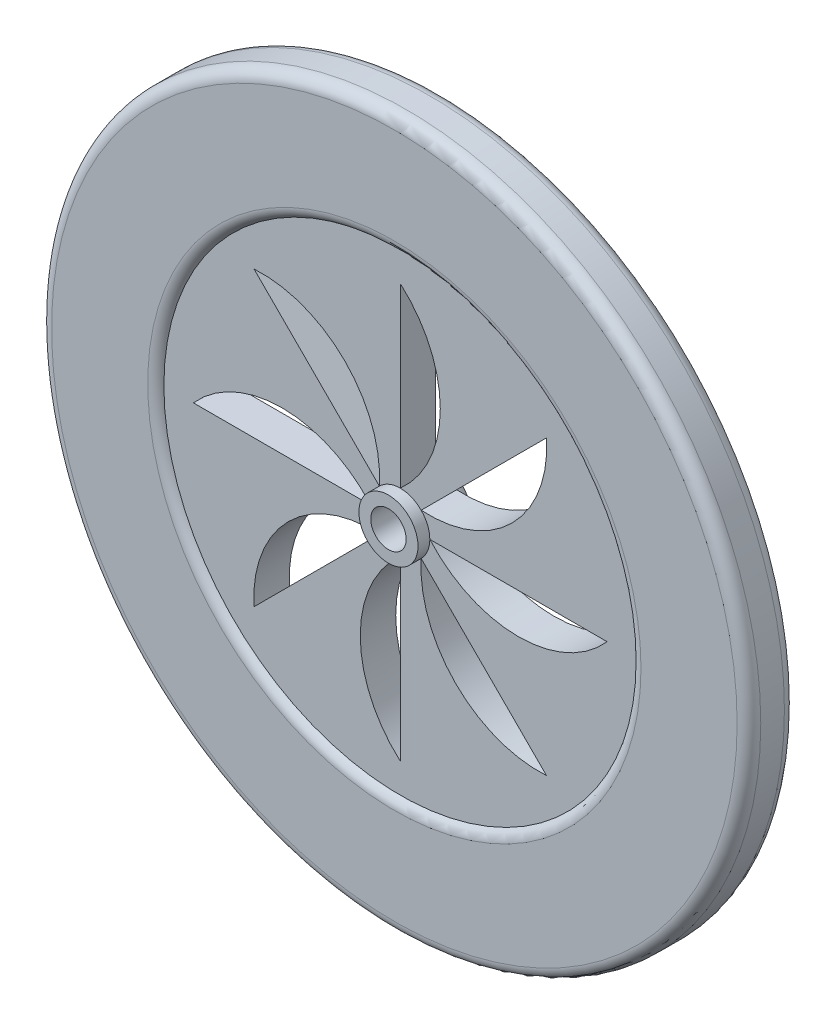
ISO-10303-21;
HEADER;
FILE_DESCRIPTION(('STEP AP214'),'2;1');
FILE_NAME('part.step','',(''),(''),'','','');
FILE_SCHEMA(('AUTOMOTIVE_DESIGN { 1 0 10303 214 1 1 1 1 }'));
ENDSEC;
DATA;
#1=APPLICATION_CONTEXT('core data for automotive mechanical design processes');
#2=APPLICATION_PROTOCOL_DEFINITION('international standard','automotive_design',2000,#1);
#3=PRODUCT_CONTEXT('',#1,'mechanical');
#4=PRODUCT('Part','Part','',(#3));
#5=PRODUCT_RELATED_PRODUCT_CATEGORY('part','',(#4));
#6=PRODUCT_DEFINITION_FORMATION('','',#4);
#7=PRODUCT_DEFINITION_CONTEXT('part definition',#1,'design');
#8=PRODUCT_DEFINITION('design','',#6,#7);
#9=PRODUCT_DEFINITION_SHAPE('','',#8);
#10=(LENGTH_UNIT() NAMED_UNIT(*) SI_UNIT(.MILLI.,.METRE.));
#11=(NAMED_UNIT(*) PLANE_ANGLE_UNIT() SI_UNIT($,.RADIAN.));
#12=(NAMED_UNIT(*) SI_UNIT($,.STERADIAN.) SOLID_ANGLE_UNIT());
#13=UNCERTAINTY_MEASURE_WITH_UNIT(LENGTH_MEASURE(1.E-05),#10,'distance_accuracy_value','');
#14=(GEOMETRIC_REPRESENTATION_CONTEXT(3) GLOBAL_UNCERTAINTY_ASSIGNED_CONTEXT((#13)) GLOBAL_UNIT_ASSIGNED_CONTEXT((#10,
#11,#12)) REPRESENTATION_CONTEXT('',''));
#15=CARTESIAN_POINT('',(0.,0.,0.));
#16=DIRECTION('',(0.,0.,1.));
#17=DIRECTION('',(1.,0.,0.));
#18=AXIS2_PLACEMENT_3D('',#15,#16,#17);
#19=CARTESIAN_POINT('',(0.,0.,2.5));
#20=DIRECTION('',(0.,0.,-1.));
#21=DIRECTION('',(-1.,0.,0.));
#22=AXIS2_PLACEMENT_3D('',#19,#20,#21);
#23=CYLINDRICAL_SURFACE('',#22,2.5);
#24=CARTESIAN_POINT('',(0.,0.,1.5));
#25=DIRECTION('',(0.,0.,1.));
#26=DIRECTION('',(1.,0.,0.));
#27=AXIS2_PLACEMENT_3D('',#24,#25,#26);
#28=CIRCLE('',#27,2.5);
#29=CARTESIAN_POINT('',(2.5,0.,1.5));
#30=VERTEX_POINT('',#29);
#31=CARTESIAN_POINT('',(1.76776695296637,1.76776695296637,1.5));
#32=VERTEX_POINT('',#31);
#33=EDGE_CURVE('E390',#30,#32,#28,.T.);
#34=ORIENTED_EDGE('',*,*,#33,.T.);
#35=CARTESIAN_POINT('',(0.,2.5,1.5));
#36=VERTEX_POINT('',#35);
#37=EDGE_CURVE('E400',#32,#36,#28,.T.);
#38=ORIENTED_EDGE('',*,*,#37,.T.);
#39=CARTESIAN_POINT('',(-1.76776695296635,1.76776695296639,1.5));
#40=VERTEX_POINT('',#39);
#41=EDGE_CURVE('E603',#36,#40,#28,.T.);
#42=ORIENTED_EDGE('',*,*,#41,.T.);
#43=CARTESIAN_POINT('',(-2.5,0.,1.5));
#44=VERTEX_POINT('',#43);
#45=EDGE_CURVE('E605',#40,#44,#28,.T.);
#46=ORIENTED_EDGE('',*,*,#45,.T.);
#47=CARTESIAN_POINT('',(-1.76776695296638,-1.76776695296635,1.5));
#48=VERTEX_POINT('',#47);
#49=EDGE_CURVE('E608',#44,#48,#28,.T.);
#50=ORIENTED_EDGE('',*,*,#49,.T.);
#51=CARTESIAN_POINT('',(0.,-2.5,1.5));
#52=VERTEX_POINT('',#51);
#53=EDGE_CURVE('E612',#48,#52,#28,.T.);
#54=ORIENTED_EDGE('',*,*,#53,.T.);
#55=CARTESIAN_POINT('',(1.76776695296636,-1.76776695296638,1.5));
#56=VERTEX_POINT('',#55);
#57=EDGE_CURVE('E593',#52,#56,#28,.T.);
#58=ORIENTED_EDGE('',*,*,#57,.T.);
#59=EDGE_CURVE('E384',#56,#30,#28,.T.);
#60=ORIENTED_EDGE('',*,*,#59,.T.);
#61=EDGE_LOOP('',(#34,#38,#42,#46,#50,#54,#58,#60));
#62=FACE_BOUND('',#61,.T.);
#63=CARTESIAN_POINT('',(0.,0.,2.5));
#64=DIRECTION('',(0.,0.,1.));
#65=DIRECTION('',(1.,0.,0.));
#66=AXIS2_PLACEMENT_3D('',#63,#64,#65);
#67=CIRCLE('',#66,2.5);
#68=CARTESIAN_POINT('',(2.5,0.,2.5));
#69=VERTEX_POINT('',#68);
#70=EDGE_CURVE('E385',#69,#69,#67,.T.);
#71=ORIENTED_EDGE('',*,*,#70,.F.);
#72=EDGE_LOOP('',(#71));
#73=FACE_BOUND('',#72,.T.);
#74=ADVANCED_FACE('F45',(#62,#73),#23,.T.);
#75=CARTESIAN_POINT('',(0.,0.,2.5));
#76=DIRECTION('',(0.,0.,1.));
#77=DIRECTION('',(1.,0.,0.));
#78=AXIS2_PLACEMENT_3D('',#75,#76,#77);
#79=PLANE('',#78);
#80=CARTESIAN_POINT('',(0.,0.,2.5));
#81=DIRECTION('',(0.,0.,1.));
#82=DIRECTION('',(1.,0.,0.));
#83=AXIS2_PLACEMENT_3D('',#80,#81,#82);
#84=CIRCLE('',#83,1.5);
#85=CARTESIAN_POINT('',(1.5,0.,2.5));
#86=VERTEX_POINT('',#85);
#87=EDGE_CURVE('E195',#86,#86,#84,.T.);
#88=ORIENTED_EDGE('',*,*,#87,.F.);
#89=EDGE_LOOP('',(#88));
#90=FACE_BOUND('',#89,.T.);
#91=ORIENTED_EDGE('',*,*,#70,.T.);
#92=EDGE_LOOP('',(#91));
#93=FACE_BOUND('',#92,.T.);
#94=ADVANCED_FACE('F447',(#90,#93),#79,.T.);
#95=CARTESIAN_POINT('',(0.,0.,1.5));
#96=DIRECTION('',(0.,0.,1.));
#97=DIRECTION('',(1.,0.,0.));
#98=AXIS2_PLACEMENT_3D('',#95,#96,#97);
#99=PLANE('',#98);
#100=CARTESIAN_POINT('',(6.61437827766162,-10.,1.5));
#101=DIRECTION('',(0.,0.,1.));
#102=DIRECTION('',(-1.,0.,0.));
#103=AXIS2_PLACEMENT_3D('',#100,#101,#102);
#104=CIRCLE('',#103,10.0000000000001);
#105=CARTESIAN_POINT('',(1.43027032251381E-13,-17.5,1.5));
#106=VERTEX_POINT('',#105);
#107=EDGE_CURVE('E69',#52,#106,#104,.T.);
#108=ORIENTED_EDGE('',*,*,#107,.F.);
#109=ORIENTED_EDGE('',*,*,#53,.F.);
#110=DIRECTION('',(0.707106781186541,0.707106781186554,0.));
#111=VECTOR('',#110,1.);
#112=CARTESIAN_POINT('',(-1.76776695296638,-1.76776695296635,1.5));
#113=LINE('',#112,#111);
#114=CARTESIAN_POINT('',(-12.3743686707645,-12.3743686707646,1.5));
#115=VERTEX_POINT('',#114);
#116=EDGE_CURVE('E238',#115,#48,#113,.T.);
#117=ORIENTED_EDGE('',*,*,#116,.F.);
#118=CARTESIAN_POINT('',(-2.39399607839793,-11.748139545333,1.5));
#119=DIRECTION('',(0.,0.,1.));
#120=DIRECTION('',(-1.,0.,0.));
#121=AXIS2_PLACEMENT_3D('',#118,#119,#120);
#122=CIRCLE('',#121,10.);
#123=EDGE_CURVE('E242',#48,#115,#122,.T.);
#124=ORIENTED_EDGE('',*,*,#123,.F.);
#125=ORIENTED_EDGE('',*,*,#49,.F.);
#126=DIRECTION('',(1.,0.,0.));
#127=VECTOR('',#126,1.);
#128=CARTESIAN_POINT('',(-2.5,0.,1.5));
#129=LINE('',#128,#127);
#130=CARTESIAN_POINT('',(-17.4999999999999,0.,1.5));
#131=VERTEX_POINT('',#130);
#132=EDGE_CURVE('E260',#131,#44,#129,.T.);
#133=ORIENTED_EDGE('',*,*,#132,.F.);
#134=CARTESIAN_POINT('',(-9.99999999999993,-6.61437827766155,1.5));
#135=DIRECTION('',(0.,0.,1.));
#136=DIRECTION('',(-1.,0.,0.));
#137=AXIS2_PLACEMENT_3D('',#134,#135,#136);
#138=CIRCLE('',#137,10.);
#139=EDGE_CURVE('E237',#44,#131,#138,.T.);
#140=ORIENTED_EDGE('',*,*,#139,.F.);
#141=ORIENTED_EDGE('',*,*,#45,.F.);
#142=DIRECTION('',(0.70710678118655,-0.707106781186545,0.));
#143=VECTOR('',#142,1.);
#144=CARTESIAN_POINT('',(-1.76776695296635,1.76776695296639,1.5));
#145=LINE('',#144,#143);
#146=CARTESIAN_POINT('',(-12.3743686707646,12.3743686707645,1.5));
#147=VERTEX_POINT('',#146);
#148=EDGE_CURVE('E214',#147,#40,#145,.T.);
#149=ORIENTED_EDGE('',*,*,#148,.F.);
#150=CARTESIAN_POINT('',(-11.7481395453329,2.39399607839799,1.5));
#151=DIRECTION('',(0.,0.,1.));
#152=DIRECTION('',(-1.,0.,0.));
#153=AXIS2_PLACEMENT_3D('',#150,#151,#152);
#154=CIRCLE('',#153,10.);
#155=EDGE_CURVE('E218',#40,#147,#154,.T.);
#156=ORIENTED_EDGE('',*,*,#155,.F.);
#157=ORIENTED_EDGE('',*,*,#41,.F.);
#158=DIRECTION('',(0.,-1.,0.));
#159=VECTOR('',#158,1.);
#160=CARTESIAN_POINT('',(0.,2.5,1.5));
#161=LINE('',#160,#159);
#162=CARTESIAN_POINT('',(0.,17.5,1.5));
#163=VERTEX_POINT('',#162);
#164=EDGE_CURVE('E364',#163,#36,#161,.T.);
#165=ORIENTED_EDGE('',*,*,#164,.F.);
#166=CARTESIAN_POINT('',(-6.61437827766148,10.,1.5));
#167=DIRECTION('',(0.,0.,1.));
#168=DIRECTION('',(-1.,0.,0.));
#169=AXIS2_PLACEMENT_3D('',#166,#167,#168);
#170=CIRCLE('',#169,10.);
#171=EDGE_CURVE('E332',#36,#163,#170,.T.);
#172=ORIENTED_EDGE('',*,*,#171,.F.);
#173=ORIENTED_EDGE('',*,*,#37,.F.);
#174=DIRECTION('',(-0.707106781186546,-0.707106781186549,0.));
#175=VECTOR('',#174,1.);
#176=CARTESIAN_POINT('',(1.76776695296637,1.76776695296637,1.5));
#177=LINE('',#176,#175);
#178=CARTESIAN_POINT('',(12.3743686707646,12.3743686707646,1.5));
#179=VERTEX_POINT('',#178);
#180=EDGE_CURVE('E324',#179,#32,#177,.T.);
#181=ORIENTED_EDGE('',*,*,#180,.F.);
#182=CARTESIAN_POINT('',(2.39399607839807,11.748139545333,1.5));
#183=DIRECTION('',(0.,0.,1.));
#184=DIRECTION('',(-1.,0.,0.));
#185=AXIS2_PLACEMENT_3D('',#182,#183,#184);
#186=CIRCLE('',#185,10.);
#187=EDGE_CURVE('E328',#32,#179,#186,.T.);
#188=ORIENTED_EDGE('',*,*,#187,.F.);
#189=ORIENTED_EDGE('',*,*,#33,.F.);
#190=DIRECTION('',(-1.,0.,0.));
#191=VECTOR('',#190,1.);
#192=CARTESIAN_POINT('',(2.5,0.,1.5));
#193=LINE('',#192,#191);
#194=CARTESIAN_POINT('',(17.5000000000001,0.,1.5));
#195=VERTEX_POINT('',#194);
#196=EDGE_CURVE('E346',#195,#30,#193,.T.);
#197=ORIENTED_EDGE('',*,*,#196,.F.);
#198=CARTESIAN_POINT('',(10.0000000000001,6.61437827766155,1.5));
#199=DIRECTION('',(0.,0.,1.));
#200=DIRECTION('',(-1.,0.,0.));
#201=AXIS2_PLACEMENT_3D('',#198,#199,#200);
#202=CIRCLE('',#201,10.0000000000001);
#203=EDGE_CURVE('E323',#30,#195,#202,.T.);
#204=ORIENTED_EDGE('',*,*,#203,.F.);
#205=ORIENTED_EDGE('',*,*,#59,.F.);
#206=DIRECTION('',(-0.707106781186554,0.707106781186541,0.));
#207=VECTOR('',#206,1.);
#208=CARTESIAN_POINT('',(1.76776695296636,-1.76776695296638,1.5));
#209=LINE('',#208,#207);
#210=CARTESIAN_POINT('',(12.3743686707647,-12.3743686707645,1.5));
#211=VERTEX_POINT('',#210);
#212=EDGE_CURVE('E281',#211,#56,#209,.T.);
#213=ORIENTED_EDGE('',*,*,#212,.F.);
#214=CARTESIAN_POINT('',(11.748139545333,-2.393996078398,1.5));
#215=DIRECTION('',(0.,0.,1.));
#216=DIRECTION('',(-1.,0.,0.));
#217=AXIS2_PLACEMENT_3D('',#214,#215,#216);
#218=CIRCLE('',#217,10.0000000000001);
#219=EDGE_CURVE('E285',#56,#211,#218,.T.);
#220=ORIENTED_EDGE('',*,*,#219,.F.);
#221=ORIENTED_EDGE('',*,*,#57,.F.);
#222=DIRECTION('',(0.,1.,0.));
#223=VECTOR('',#222,1.);
#224=CARTESIAN_POINT('',(0.,-2.5,1.5));
#225=LINE('',#224,#223);
#226=EDGE_CURVE('E302',#106,#52,#225,.T.);
#227=ORIENTED_EDGE('',*,*,#226,.F.);
#228=EDGE_LOOP('',(#108,#109,#117,#124,#125,#133,#140,#141,#149,#156,#157,#165,#172,#173,#181,
#188,#189,#197,#204,#205,#213,#220,#221,#227));
#229=FACE_BOUND('',#228,.T.);
#230=CARTESIAN_POINT('',(0.,0.,1.5));
#231=DIRECTION('',(0.,0.,1.));
#232=DIRECTION('',(1.,0.,0.));
#233=AXIS2_PLACEMENT_3D('',#230,#231,#232);
#234=CIRCLE('',#233,20.);
#235=CARTESIAN_POINT('',(20.,0.,1.5));
#236=VERTEX_POINT('',#235);
#237=EDGE_CURVE('E199',#236,#236,#234,.F.);
#238=ORIENTED_EDGE('',*,*,#237,.F.);
#239=EDGE_LOOP('',(#238));
#240=FACE_BOUND('',#239,.T.);
#241=ADVANCED_FACE('F453',(#229,#240),#99,.T.);
#242=CARTESIAN_POINT('',(0.,0.,-1.5));
#243=DIRECTION('',(0.,0.,1.));
#244=DIRECTION('',(1.,0.,0.));
#245=AXIS2_PLACEMENT_3D('',#242,#243,#244);
#246=PLANE('',#245);
#247=CARTESIAN_POINT('',(0.,0.,-1.5));
#248=DIRECTION('',(0.,0.,1.));
#249=DIRECTION('',(1.,0.,0.));
#250=AXIS2_PLACEMENT_3D('',#247,#248,#249);
#251=CIRCLE('',#250,2.5);
#252=CARTESIAN_POINT('',(-1.76776695296635,-1.76776695296638,-1.5));
#253=VERTEX_POINT('',#252);
#254=CARTESIAN_POINT('',(0.,-2.5,-1.5));
#255=VERTEX_POINT('',#254);
#256=EDGE_CURVE('E557',#253,#255,#251,.T.);
#257=ORIENTED_EDGE('',*,*,#256,.T.);
#258=CARTESIAN_POINT('',(6.61437827766162,-10.,-1.5));
#259=DIRECTION('',(0.,0.,1.));
#260=DIRECTION('',(-1.,0.,0.));
#261=AXIS2_PLACEMENT_3D('',#258,#259,#260);
#262=CIRCLE('',#261,10.0000000000001);
#263=CARTESIAN_POINT('',(1.43027032251381E-13,-17.5,-1.5));
#264=VERTEX_POINT('',#263);
#265=EDGE_CURVE('E306',#255,#264,#262,.T.);
#266=ORIENTED_EDGE('',*,*,#265,.T.);
#267=DIRECTION('',(0.,1.,0.));
#268=VECTOR('',#267,1.);
#269=CARTESIAN_POINT('',(0.,-2.5,-1.5));
#270=LINE('',#269,#268);
#271=EDGE_CURVE('E299',#264,#255,#270,.T.);
#272=ORIENTED_EDGE('',*,*,#271,.T.);
#273=CARTESIAN_POINT('',(1.76776695296642,-1.76776695296632,-1.5));
#274=VERTEX_POINT('',#273);
#275=EDGE_CURVE('E569',#255,#274,#251,.T.);
#276=ORIENTED_EDGE('',*,*,#275,.T.);
#277=CARTESIAN_POINT('',(11.748139545333,-2.393996078398,-1.5));
#278=DIRECTION('',(0.,0.,1.));
#279=DIRECTION('',(-1.,0.,0.));
#280=AXIS2_PLACEMENT_3D('',#277,#278,#279);
#281=CIRCLE('',#280,10.0000000000001);
#282=CARTESIAN_POINT('',(12.3743686707647,-12.3743686707645,-1.5));
#283=VERTEX_POINT('',#282);
#284=EDGE_CURVE('E286',#274,#283,#281,.T.);
#285=ORIENTED_EDGE('',*,*,#284,.T.);
#286=DIRECTION('',(-0.707106781186554,0.707106781186541,0.));
#287=VECTOR('',#286,1.);
#288=CARTESIAN_POINT('',(1.76776695296636,-1.76776695296638,-1.5));
#289=LINE('',#288,#287);
#290=EDGE_CURVE('E277',#283,#274,#289,.T.);
#291=ORIENTED_EDGE('',*,*,#290,.T.);
#292=CARTESIAN_POINT('',(2.5,0.,-1.5));
#293=VERTEX_POINT('',#292);
#294=EDGE_CURVE('E389',#274,#293,#251,.T.);
#295=ORIENTED_EDGE('',*,*,#294,.T.);
#296=CARTESIAN_POINT('',(10.0000000000001,6.61437827766155,-1.5));
#297=DIRECTION('',(0.,0.,1.));
#298=DIRECTION('',(-1.,0.,0.));
#299=AXIS2_PLACEMENT_3D('',#296,#297,#298);
#300=CIRCLE('',#299,10.0000000000001);
#301=CARTESIAN_POINT('',(17.5000000000001,0.,-1.5));
#302=VERTEX_POINT('',#301);
#303=EDGE_CURVE('E350',#293,#302,#300,.T.);
#304=ORIENTED_EDGE('',*,*,#303,.T.);
#305=DIRECTION('',(-1.,0.,0.));
#306=VECTOR('',#305,1.);
#307=CARTESIAN_POINT('',(2.5,0.,-1.5));
#308=LINE('',#307,#306);
#309=EDGE_CURVE('E343',#302,#293,#308,.T.);
#310=ORIENTED_EDGE('',*,*,#309,.T.);
#311=CARTESIAN_POINT('',(1.76776695296634,1.7677669529664,-1.5));
#312=VERTEX_POINT('',#311);
#313=EDGE_CURVE('E391',#293,#312,#251,.T.);
#314=ORIENTED_EDGE('',*,*,#313,.T.);
#315=CARTESIAN_POINT('',(2.39399607839807,11.748139545333,-1.5));
#316=DIRECTION('',(0.,0.,1.));
#317=DIRECTION('',(-1.,0.,0.));
#318=AXIS2_PLACEMENT_3D('',#315,#316,#317);
#319=CIRCLE('',#318,10.);
#320=CARTESIAN_POINT('',(12.3743686707646,12.3743686707646,-1.5));
#321=VERTEX_POINT('',#320);
#322=EDGE_CURVE('E329',#312,#321,#319,.T.);
#323=ORIENTED_EDGE('',*,*,#322,.T.);
#324=DIRECTION('',(-0.707106781186546,-0.707106781186549,0.));
#325=VECTOR('',#324,1.);
#326=CARTESIAN_POINT('',(1.76776695296637,1.76776695296637,-1.5));
#327=LINE('',#326,#325);
#328=EDGE_CURVE('E319',#321,#312,#327,.T.);
#329=ORIENTED_EDGE('',*,*,#328,.T.);
#330=CARTESIAN_POINT('',(0.,2.5,-1.5));
#331=VERTEX_POINT('',#330);
#332=EDGE_CURVE('E396',#312,#331,#251,.T.);
#333=ORIENTED_EDGE('',*,*,#332,.T.);
#334=CARTESIAN_POINT('',(-6.61437827766148,10.,-1.5));
#335=DIRECTION('',(0.,0.,1.));
#336=DIRECTION('',(-1.,0.,0.));
#337=AXIS2_PLACEMENT_3D('',#334,#335,#336);
#338=CIRCLE('',#337,10.);
#339=CARTESIAN_POINT('',(0.,17.5,-1.5));
#340=VERTEX_POINT('',#339);
#341=EDGE_CURVE('E359',#331,#340,#338,.T.);
#342=ORIENTED_EDGE('',*,*,#341,.T.);
#343=DIRECTION('',(0.,-1.,0.));
#344=VECTOR('',#343,1.);
#345=CARTESIAN_POINT('',(0.,2.5,-1.5));
#346=LINE('',#345,#344);
#347=EDGE_CURVE('E363',#340,#331,#346,.T.);
#348=ORIENTED_EDGE('',*,*,#347,.T.);
#349=CARTESIAN_POINT('',(-1.76776695296635,1.76776695296639,-1.5));
#350=VERTEX_POINT('',#349);
#351=EDGE_CURVE('E631',#331,#350,#251,.T.);
#352=ORIENTED_EDGE('',*,*,#351,.T.);
#353=CARTESIAN_POINT('',(-11.7481395453329,2.39399607839799,-1.5));
#354=DIRECTION('',(0.,0.,1.));
#355=DIRECTION('',(-1.,0.,0.));
#356=AXIS2_PLACEMENT_3D('',#353,#354,#355);
#357=CIRCLE('',#356,10.);
#358=CARTESIAN_POINT('',(-12.3743686707646,12.3743686707645,-1.5));
#359=VERTEX_POINT('',#358);
#360=EDGE_CURVE('E219',#350,#359,#357,.T.);
#361=ORIENTED_EDGE('',*,*,#360,.T.);
#362=DIRECTION('',(0.70710678118655,-0.707106781186545,0.));
#363=VECTOR('',#362,1.);
#364=CARTESIAN_POINT('',(-1.76776695296635,1.76776695296639,-1.5));
#365=LINE('',#364,#363);
#366=EDGE_CURVE('E211',#359,#350,#365,.T.);
#367=ORIENTED_EDGE('',*,*,#366,.T.);
#368=CARTESIAN_POINT('',(-2.5,0.,-1.5));
#369=VERTEX_POINT('',#368);
#370=EDGE_CURVE('E629',#350,#369,#251,.T.);
#371=ORIENTED_EDGE('',*,*,#370,.T.);
#372=CARTESIAN_POINT('',(-9.99999999999993,-6.61437827766155,-1.5));
#373=DIRECTION('',(0.,0.,1.));
#374=DIRECTION('',(-1.,0.,0.));
#375=AXIS2_PLACEMENT_3D('',#372,#373,#374);
#376=CIRCLE('',#375,10.);
#377=CARTESIAN_POINT('',(-17.4999999999999,0.,-1.5));
#378=VERTEX_POINT('',#377);
#379=EDGE_CURVE('E264',#369,#378,#376,.T.);
#380=ORIENTED_EDGE('',*,*,#379,.T.);
#381=DIRECTION('',(1.,0.,0.));
#382=VECTOR('',#381,1.);
#383=CARTESIAN_POINT('',(-2.5,0.,-1.5));
#384=LINE('',#383,#382);
#385=EDGE_CURVE('E257',#378,#369,#384,.T.);
#386=ORIENTED_EDGE('',*,*,#385,.T.);
#387=EDGE_CURVE('E568',#369,#253,#251,.T.);
#388=ORIENTED_EDGE('',*,*,#387,.T.);
#389=CARTESIAN_POINT('',(-2.39399607839793,-11.748139545333,-1.5));
#390=DIRECTION('',(0.,0.,1.));
#391=DIRECTION('',(-1.,0.,0.));
#392=AXIS2_PLACEMENT_3D('',#389,#390,#391);
#393=CIRCLE('',#392,10.);
#394=CARTESIAN_POINT('',(-12.3743686707645,-12.3743686707646,-1.5));
#395=VERTEX_POINT('',#394);
#396=EDGE_CURVE('E243',#253,#395,#393,.T.);
#397=ORIENTED_EDGE('',*,*,#396,.T.);
#398=DIRECTION('',(0.707106781186541,0.707106781186554,0.));
#399=VECTOR('',#398,1.);
#400=CARTESIAN_POINT('',(-1.76776695296638,-1.76776695296635,-1.5));
#401=LINE('',#400,#399);
#402=EDGE_CURVE('E233',#395,#253,#401,.T.);
#403=ORIENTED_EDGE('',*,*,#402,.T.);
#404=EDGE_LOOP('',(#257,#266,#272,#276,#285,#291,#295,#304,#310,#314,#323,#329,#333,#342,#348,
#352,#361,#367,#371,#380,#386,#388,#397,#403));
#405=FACE_BOUND('',#404,.T.);
#406=CARTESIAN_POINT('',(0.,0.,-1.5));
#407=DIRECTION('',(0.,0.,1.));
#408=DIRECTION('',(1.,0.,0.));
#409=AXIS2_PLACEMENT_3D('',#406,#407,#408);
#410=CIRCLE('',#409,20.);
#411=CARTESIAN_POINT('',(20.,0.,-1.5));
#412=VERTEX_POINT('',#411);
#413=EDGE_CURVE('E377',#412,#412,#410,.T.);
#414=ORIENTED_EDGE('',*,*,#413,.F.);
#415=EDGE_LOOP('',(#414));
#416=FACE_BOUND('',#415,.T.);
#417=ADVANCED_FACE('F546',(#405,#416),#246,.F.);
#418=CARTESIAN_POINT('',(0.,0.,-2.5));
#419=DIRECTION('',(0.,0.,1.));
#420=DIRECTION('',(1.,0.,0.));
#421=AXIS2_PLACEMENT_3D('',#418,#419,#420);
#422=PLANE('',#421);
#423=CARTESIAN_POINT('',(0.,0.,-2.5));
#424=DIRECTION('',(0.,0.,1.));
#425=DIRECTION('',(1.,0.,0.));
#426=AXIS2_PLACEMENT_3D('',#423,#424,#425);
#427=CIRCLE('',#426,1.5);
#428=CARTESIAN_POINT('',(1.5,0.,-2.5));
#429=VERTEX_POINT('',#428);
#430=EDGE_CURVE('E395',#429,#429,#427,.F.);
#431=ORIENTED_EDGE('',*,*,#430,.T.);
#432=EDGE_LOOP('',(#431));
#433=FACE_BOUND('',#432,.T.);
#434=ADVANCED_FACE('F459',(#433),#422,.F.);
#435=CARTESIAN_POINT('',(-6.61437827766148,10.,-1.5));
#436=DIRECTION('',(0.,0.,1.));
#437=DIRECTION('',(1.,0.,0.));
#438=AXIS2_PLACEMENT_3D('',#435,#436,#437);
#439=CYLINDRICAL_SURFACE('',#438,10.);
#440=ORIENTED_EDGE('',*,*,#171,.T.);
#441=DIRECTION('',(0.,0.,1.));
#442=VECTOR('',#441,1.);
#443=CARTESIAN_POINT('',(0.,17.5,-1.5));
#444=LINE('',#443,#442);
#445=EDGE_CURVE('E368',#340,#163,#444,.T.);
#446=ORIENTED_EDGE('',*,*,#445,.F.);
#447=ORIENTED_EDGE('',*,*,#341,.F.);
#448=DIRECTION('',(0.,0.,1.));
#449=VECTOR('',#448,1.);
#450=CARTESIAN_POINT('',(0.,2.5,-1.5));
#451=LINE('',#450,#449);
#452=EDGE_CURVE('E374',#331,#36,#451,.T.);
#453=ORIENTED_EDGE('',*,*,#452,.T.);
#454=EDGE_LOOP('',(#440,#446,#447,#453));
#455=FACE_BOUND('',#454,.T.);
#456=ADVANCED_FACE('F539',(#455),#439,.F.);
#457=CARTESIAN_POINT('',(0.,2.5,-1.5));
#458=DIRECTION('',(-1.,0.,0.));
#459=DIRECTION('',(0.,0.,1.));
#460=AXIS2_PLACEMENT_3D('',#457,#458,#459);
#461=PLANE('',#460);
#462=ORIENTED_EDGE('',*,*,#164,.T.);
#463=ORIENTED_EDGE('',*,*,#452,.F.);
#464=ORIENTED_EDGE('',*,*,#347,.F.);
#465=ORIENTED_EDGE('',*,*,#445,.T.);
#466=EDGE_LOOP('',(#462,#463,#464,#465));
#467=FACE_BOUND('',#466,.T.);
#468=ADVANCED_FACE('F500',(#467),#461,.F.);
#469=CARTESIAN_POINT('',(-2.39399607839793,-11.748139545333,-1.5));
#470=DIRECTION('',(0.,0.,1.));
#471=DIRECTION('',(1.,0.,0.));
#472=AXIS2_PLACEMENT_3D('',#469,#470,#471);
#473=CYLINDRICAL_SURFACE('',#472,10.);
#474=ORIENTED_EDGE('',*,*,#123,.T.);
#475=DIRECTION('',(0.,0.,1.));
#476=VECTOR('',#475,1.);
#477=CARTESIAN_POINT('',(-12.3743686707645,-12.3743686707646,-1.5));
#478=LINE('',#477,#476);
#479=EDGE_CURVE('E229',#395,#115,#478,.T.);
#480=ORIENTED_EDGE('',*,*,#479,.F.);
#481=ORIENTED_EDGE('',*,*,#396,.F.);
#482=DIRECTION('',(0.,0.,1.));
#483=VECTOR('',#482,1.);
#484=CARTESIAN_POINT('',(-1.76776695296638,-1.76776695296635,-1.5));
#485=LINE('',#484,#483);
#486=EDGE_CURVE('E234',#253,#48,#485,.T.);
#487=ORIENTED_EDGE('',*,*,#486,.T.);
#488=EDGE_LOOP('',(#474,#480,#481,#487));
#489=FACE_BOUND('',#488,.T.);
#490=ADVANCED_FACE('F496',(#489),#473,.F.);
#491=CARTESIAN_POINT('',(-1.76776695296638,-1.76776695296635,-1.5));
#492=DIRECTION('',(0.707106781186554,-0.707106781186541,0.));
#493=DIRECTION('',(0.707106781186541,0.707106781186554,0.));
#494=AXIS2_PLACEMENT_3D('',#491,#492,#493);
#495=PLANE('',#494);
#496=ORIENTED_EDGE('',*,*,#116,.T.);
#497=ORIENTED_EDGE('',*,*,#486,.F.);
#498=ORIENTED_EDGE('',*,*,#402,.F.);
#499=ORIENTED_EDGE('',*,*,#479,.T.);
#500=EDGE_LOOP('',(#496,#497,#498,#499));
#501=FACE_BOUND('',#500,.T.);
#502=ADVANCED_FACE('F499',(#501),#495,.F.);
#503=CARTESIAN_POINT('',(-9.99999999999993,-6.61437827766155,-1.5));
#504=DIRECTION('',(0.,0.,1.));
#505=DIRECTION('',(1.,0.,0.));
#506=AXIS2_PLACEMENT_3D('',#503,#504,#505);
#507=CYLINDRICAL_SURFACE('',#506,10.);
#508=ORIENTED_EDGE('',*,*,#139,.T.);
#509=DIRECTION('',(0.,0.,1.));
#510=VECTOR('',#509,1.);
#511=CARTESIAN_POINT('',(-17.4999999999999,0.,-1.5));
#512=LINE('',#511,#510);
#513=EDGE_CURVE('E253',#378,#131,#512,.T.);
#514=ORIENTED_EDGE('',*,*,#513,.F.);
#515=ORIENTED_EDGE('',*,*,#379,.F.);
#516=DIRECTION('',(0.,0.,1.));
#517=VECTOR('',#516,1.);
#518=CARTESIAN_POINT('',(-2.5,0.,-1.5));
#519=LINE('',#518,#517);
#520=EDGE_CURVE('E222',#369,#44,#519,.T.);
#521=ORIENTED_EDGE('',*,*,#520,.T.);
#522=EDGE_LOOP('',(#508,#514,#515,#521));
#523=FACE_BOUND('',#522,.T.);
#524=ADVANCED_FACE('F504',(#523),#507,.F.);
#525=CARTESIAN_POINT('',(-2.5,0.,-1.5));
#526=DIRECTION('',(0.,-1.,0.));
#527=DIRECTION('',(1.,0.,0.));
#528=AXIS2_PLACEMENT_3D('',#525,#526,#527);
#529=PLANE('',#528);
#530=ORIENTED_EDGE('',*,*,#132,.T.);
#531=ORIENTED_EDGE('',*,*,#520,.F.);
#532=ORIENTED_EDGE('',*,*,#385,.F.);
#533=ORIENTED_EDGE('',*,*,#513,.T.);
#534=EDGE_LOOP('',(#530,#531,#532,#533));
#535=FACE_BOUND('',#534,.T.);
#536=ADVANCED_FACE('F490',(#535),#529,.F.);
#537=CARTESIAN_POINT('',(-11.7481395453329,2.39399607839799,-1.5));
#538=DIRECTION('',(0.,0.,1.));
#539=DIRECTION('',(1.,0.,0.));
#540=AXIS2_PLACEMENT_3D('',#537,#538,#539);
#541=CYLINDRICAL_SURFACE('',#540,10.);
#542=ORIENTED_EDGE('',*,*,#155,.T.);
#543=DIRECTION('',(0.,0.,1.));
#544=VECTOR('',#543,1.);
#545=CARTESIAN_POINT('',(-12.3743686707646,12.3743686707645,-1.5));
#546=LINE('',#545,#544);
#547=EDGE_CURVE('E207',#359,#147,#546,.T.);
#548=ORIENTED_EDGE('',*,*,#547,.F.);
#549=ORIENTED_EDGE('',*,*,#360,.F.);
#550=DIRECTION('',(0.,0.,1.));
#551=VECTOR('',#550,1.);
#552=CARTESIAN_POINT('',(-1.76776695296635,1.76776695296639,-1.5));
#553=LINE('',#552,#551);
#554=EDGE_CURVE('E206',#350,#40,#553,.T.);
#555=ORIENTED_EDGE('',*,*,#554,.T.);
#556=EDGE_LOOP('',(#542,#548,#549,#555));
#557=FACE_BOUND('',#556,.T.);
#558=ADVANCED_FACE('F486',(#557),#541,.F.);
#559=CARTESIAN_POINT('',(-1.76776695296635,1.76776695296639,-1.5));
#560=DIRECTION('',(-0.707106781186545,-0.70710678118655,0.));
#561=DIRECTION('',(0.70710678118655,-0.707106781186545,0.));
#562=AXIS2_PLACEMENT_3D('',#559,#560,#561);
#563=PLANE('',#562);
#564=ORIENTED_EDGE('',*,*,#148,.T.);
#565=ORIENTED_EDGE('',*,*,#554,.F.);
#566=ORIENTED_EDGE('',*,*,#366,.F.);
#567=ORIENTED_EDGE('',*,*,#547,.T.);
#568=EDGE_LOOP('',(#564,#565,#566,#567));
#569=FACE_BOUND('',#568,.T.);
#570=ADVANCED_FACE('F489',(#569),#563,.F.);
#571=CARTESIAN_POINT('',(2.39399607839807,11.748139545333,-1.5));
#572=DIRECTION('',(0.,0.,1.));
#573=DIRECTION('',(1.,0.,0.));
#574=AXIS2_PLACEMENT_3D('',#571,#572,#573);
#575=CYLINDRICAL_SURFACE('',#574,10.);
#576=ORIENTED_EDGE('',*,*,#187,.T.);
#577=DIRECTION('',(0.,0.,1.));
#578=VECTOR('',#577,1.);
#579=CARTESIAN_POINT('',(12.3743686707646,12.3743686707646,-1.5));
#580=LINE('',#579,#578);
#581=EDGE_CURVE('E315',#321,#179,#580,.T.);
#582=ORIENTED_EDGE('',*,*,#581,.F.);
#583=ORIENTED_EDGE('',*,*,#322,.F.);
#584=DIRECTION('',(0.,0.,1.));
#585=VECTOR('',#584,1.);
#586=CARTESIAN_POINT('',(1.76776695296637,1.76776695296637,-1.5));
#587=LINE('',#586,#585);
#588=EDGE_CURVE('E320',#312,#32,#587,.T.);
#589=ORIENTED_EDGE('',*,*,#588,.T.);
#590=EDGE_LOOP('',(#576,#582,#583,#589));
#591=FACE_BOUND('',#590,.T.);
#592=ADVANCED_FACE('F494',(#591),#575,.F.);
#593=CARTESIAN_POINT('',(1.76776695296637,1.76776695296637,-1.5));
#594=DIRECTION('',(-0.707106781186549,0.707106781186546,0.));
#595=DIRECTION('',(-0.707106781186546,-0.707106781186549,0.));
#596=AXIS2_PLACEMENT_3D('',#593,#594,#595);
#597=PLANE('',#596);
#598=ORIENTED_EDGE('',*,*,#180,.T.);
#599=ORIENTED_EDGE('',*,*,#588,.F.);
#600=ORIENTED_EDGE('',*,*,#328,.F.);
#601=ORIENTED_EDGE('',*,*,#581,.T.);
#602=EDGE_LOOP('',(#598,#599,#600,#601));
#603=FACE_BOUND('',#602,.T.);
#604=ADVANCED_FACE('F525',(#603),#597,.F.);
#605=CARTESIAN_POINT('',(10.0000000000001,6.61437827766155,-1.5));
#606=DIRECTION('',(0.,0.,1.));
#607=DIRECTION('',(1.,0.,0.));
#608=AXIS2_PLACEMENT_3D('',#605,#606,#607);
#609=CYLINDRICAL_SURFACE('',#608,10.0000000000001);
#610=ORIENTED_EDGE('',*,*,#203,.T.);
#611=DIRECTION('',(0.,0.,1.));
#612=VECTOR('',#611,1.);
#613=CARTESIAN_POINT('',(17.5000000000001,0.,-1.5));
#614=LINE('',#613,#612);
#615=EDGE_CURVE('E339',#302,#195,#614,.T.);
#616=ORIENTED_EDGE('',*,*,#615,.F.);
#617=ORIENTED_EDGE('',*,*,#303,.F.);
#618=DIRECTION('',(0.,0.,1.));
#619=VECTOR('',#618,1.);
#620=CARTESIAN_POINT('',(2.5,0.,-1.5));
#621=LINE('',#620,#619);
#622=EDGE_CURVE('E289',#293,#30,#621,.T.);
#623=ORIENTED_EDGE('',*,*,#622,.T.);
#624=EDGE_LOOP('',(#610,#616,#617,#623));
#625=FACE_BOUND('',#624,.T.);
#626=ADVANCED_FACE('F529',(#625),#609,.F.);
#627=CARTESIAN_POINT('',(2.5,0.,-1.5));
#628=DIRECTION('',(0.,1.,0.));
#629=DIRECTION('',(-1.,0.,0.));
#630=AXIS2_PLACEMENT_3D('',#627,#628,#629);
#631=PLANE('',#630);
#632=ORIENTED_EDGE('',*,*,#196,.T.);
#633=ORIENTED_EDGE('',*,*,#622,.F.);
#634=ORIENTED_EDGE('',*,*,#309,.F.);
#635=ORIENTED_EDGE('',*,*,#615,.T.);
#636=EDGE_LOOP('',(#632,#633,#634,#635));
#637=FACE_BOUND('',#636,.T.);
#638=ADVANCED_FACE('F516',(#637),#631,.F.);
#639=CARTESIAN_POINT('',(11.748139545333,-2.393996078398,-1.5));
#640=DIRECTION('',(0.,0.,1.));
#641=DIRECTION('',(1.,0.,0.));
#642=AXIS2_PLACEMENT_3D('',#639,#640,#641);
#643=CYLINDRICAL_SURFACE('',#642,10.0000000000001);
#644=ORIENTED_EDGE('',*,*,#219,.T.);
#645=DIRECTION('',(0.,0.,1.));
#646=VECTOR('',#645,1.);
#647=CARTESIAN_POINT('',(12.3743686707647,-12.3743686707645,-1.5));
#648=LINE('',#647,#646);
#649=EDGE_CURVE('E273',#283,#211,#648,.T.);
#650=ORIENTED_EDGE('',*,*,#649,.F.);
#651=ORIENTED_EDGE('',*,*,#284,.F.);
#652=DIRECTION('',(0.,0.,1.));
#653=VECTOR('',#652,1.);
#654=CARTESIAN_POINT('',(1.76776695296636,-1.76776695296638,-1.5));
#655=LINE('',#654,#653);
#656=EDGE_CURVE('E278',#274,#56,#655,.T.);
#657=ORIENTED_EDGE('',*,*,#656,.T.);
#658=EDGE_LOOP('',(#644,#650,#651,#657));
#659=FACE_BOUND('',#658,.T.);
#660=ADVANCED_FACE('F512',(#659),#643,.F.);
#661=CARTESIAN_POINT('',(1.76776695296636,-1.76776695296638,-1.5));
#662=DIRECTION('',(0.707106781186541,0.707106781186554,0.));
#663=DIRECTION('',(-0.707106781186554,0.707106781186541,0.));
#664=AXIS2_PLACEMENT_3D('',#661,#662,#663);
#665=PLANE('',#664);
#666=ORIENTED_EDGE('',*,*,#212,.T.);
#667=ORIENTED_EDGE('',*,*,#656,.F.);
#668=ORIENTED_EDGE('',*,*,#290,.F.);
#669=ORIENTED_EDGE('',*,*,#649,.T.);
#670=EDGE_LOOP('',(#666,#667,#668,#669));
#671=FACE_BOUND('',#670,.T.);
#672=ADVANCED_FACE('F515',(#671),#665,.F.);
#673=CARTESIAN_POINT('',(6.61437827766162,-10.,-1.5));
#674=DIRECTION('',(0.,0.,1.));
#675=DIRECTION('',(1.,0.,0.));
#676=AXIS2_PLACEMENT_3D('',#673,#674,#675);
#677=CYLINDRICAL_SURFACE('',#676,10.0000000000001);
#678=ORIENTED_EDGE('',*,*,#107,.T.);
#679=DIRECTION('',(0.,0.,1.));
#680=VECTOR('',#679,1.);
#681=CARTESIAN_POINT('',(1.43027032251381E-13,-17.5,-1.5));
#682=LINE('',#681,#680);
#683=EDGE_CURVE('E296',#264,#106,#682,.T.);
#684=ORIENTED_EDGE('',*,*,#683,.F.);
#685=ORIENTED_EDGE('',*,*,#265,.F.);
#686=DIRECTION('',(0.,0.,1.));
#687=VECTOR('',#686,1.);
#688=CARTESIAN_POINT('',(0.,-2.5,-1.5));
#689=LINE('',#688,#687);
#690=EDGE_CURVE('E246',#255,#52,#689,.T.);
#691=ORIENTED_EDGE('',*,*,#690,.T.);
#692=EDGE_LOOP('',(#678,#684,#685,#691));
#693=FACE_BOUND('',#692,.T.);
#694=ADVANCED_FACE('F442',(#693),#677,.F.);
#695=CARTESIAN_POINT('',(0.,-2.5,-1.5));
#696=DIRECTION('',(1.,0.,0.));
#697=DIRECTION('',(0.,1.,0.));
#698=AXIS2_PLACEMENT_3D('',#695,#696,#697);
#699=PLANE('',#698);
#700=ORIENTED_EDGE('',*,*,#226,.T.);
#701=ORIENTED_EDGE('',*,*,#690,.F.);
#702=ORIENTED_EDGE('',*,*,#271,.F.);
#703=ORIENTED_EDGE('',*,*,#683,.T.);
#704=EDGE_LOOP('',(#700,#701,#702,#703));
#705=FACE_BOUND('',#704,.T.);
#706=ADVANCED_FACE('F433',(#705),#699,.F.);
#707=CARTESIAN_POINT('',(0.,0.,2.));
#708=DIRECTION('',(0.,0.,1.));
#709=DIRECTION('',(1.,0.,0.));
#710=AXIS2_PLACEMENT_3D('',#707,#708,#709);
#711=PLANE('',#710);
#712=CARTESIAN_POINT('',(0.,0.,2.));
#713=DIRECTION('',(0.,0.,1.));
#714=DIRECTION('',(1.,0.,0.));
#715=AXIS2_PLACEMENT_3D('',#712,#713,#714);
#716=CIRCLE('',#715,20.8660254037844);
#717=CARTESIAN_POINT('',(20.8660254037844,0.,2.));
#718=VERTEX_POINT('',#717);
#719=EDGE_CURVE('E408',#718,#718,#716,.F.);
#720=ORIENTED_EDGE('',*,*,#719,.T.);
#721=EDGE_LOOP('',(#720));
#722=FACE_BOUND('',#721,.T.);
#723=CARTESIAN_POINT('',(0.,0.,2.));
#724=DIRECTION('',(0.,0.,1.));
#725=DIRECTION('',(1.,0.,0.));
#726=AXIS2_PLACEMENT_3D('',#723,#724,#725);
#727=CIRCLE('',#726,29.);
#728=CARTESIAN_POINT('',(29.,0.,2.));
#729=VERTEX_POINT('',#728);
#730=EDGE_CURVE('E404',#729,#729,#727,.T.);
#731=ORIENTED_EDGE('',*,*,#730,.T.);
#732=EDGE_LOOP('',(#731));
#733=FACE_BOUND('',#732,.T.);
#734=ADVANCED_FACE('F430',(#722,#733),#711,.T.);
#735=CARTESIAN_POINT('',(0.,0.,-2.));
#736=DIRECTION('',(0.,0.,1.));
#737=DIRECTION('',(1.,0.,0.));
#738=AXIS2_PLACEMENT_3D('',#735,#736,#737);
#739=PLANE('',#738);
#740=CARTESIAN_POINT('',(0.,0.,-2.));
#741=DIRECTION('',(0.,0.,1.));
#742=DIRECTION('',(1.,0.,0.));
#743=AXIS2_PLACEMENT_3D('',#740,#741,#742);
#744=CIRCLE('',#743,20.8660254037844);
#745=CARTESIAN_POINT('',(20.8660254037844,0.,-2.));
#746=VERTEX_POINT('',#745);
#747=EDGE_CURVE('E416',#746,#746,#744,.T.);
#748=ORIENTED_EDGE('',*,*,#747,.T.);
#749=EDGE_LOOP('',(#748));
#750=FACE_BOUND('',#749,.T.);
#751=CARTESIAN_POINT('',(0.,0.,-2.));
#752=DIRECTION('',(0.,0.,1.));
#753=DIRECTION('',(1.,0.,0.));
#754=AXIS2_PLACEMENT_3D('',#751,#752,#753);
#755=CIRCLE('',#754,29.);
#756=CARTESIAN_POINT('',(29.,0.,-2.));
#757=VERTEX_POINT('',#756);
#758=EDGE_CURVE('E412',#757,#757,#755,.F.);
#759=ORIENTED_EDGE('',*,*,#758,.T.);
#760=EDGE_LOOP('',(#759));
#761=FACE_BOUND('',#760,.T.);
#762=ADVANCED_FACE('F432',(#750,#761),#739,.F.);
#763=CARTESIAN_POINT('',(0.,0.,2.));
#764=DIRECTION('',(0.,0.,-1.));
#765=DIRECTION('',(-1.,0.,0.));
#766=AXIS2_PLACEMENT_3D('',#763,#764,#765);
#767=CYLINDRICAL_SURFACE('',#766,30.);
#768=CARTESIAN_POINT('',(0.,0.,-1.));
#769=DIRECTION('',(0.,0.,1.));
#770=DIRECTION('',(1.,0.,0.));
#771=AXIS2_PLACEMENT_3D('',#768,#769,#770);
#772=CIRCLE('',#771,30.);
#773=CARTESIAN_POINT('',(30.,0.,-1.));
#774=VERTEX_POINT('',#773);
#775=EDGE_CURVE('E11',#774,#774,#772,.T.);
#776=ORIENTED_EDGE('',*,*,#775,.T.);
#777=EDGE_LOOP('',(#776));
#778=FACE_BOUND('',#777,.T.);
#779=CARTESIAN_POINT('',(0.,0.,1.));
#780=DIRECTION('',(0.,0.,1.));
#781=DIRECTION('',(1.,0.,0.));
#782=AXIS2_PLACEMENT_3D('',#779,#780,#781);
#783=CIRCLE('',#782,30.);
#784=CARTESIAN_POINT('',(30.,0.,1.));
#785=VERTEX_POINT('',#784);
#786=EDGE_CURVE('E54',#785,#785,#783,.F.);
#787=ORIENTED_EDGE('',*,*,#786,.T.);
#788=EDGE_LOOP('',(#787));
#789=FACE_BOUND('',#788,.T.);
#790=ADVANCED_FACE('F423',(#778,#789),#767,.T.);
#791=CARTESIAN_POINT('',(0.,0.,0.5));
#792=DIRECTION('',(0.,0.,1.));
#793=DIRECTION('',(1.,0.,0.));
#794=AXIS2_PLACEMENT_3D('',#791,#792,#793);
#795=CYLINDRICAL_SURFACE('',#794,1.5);
#796=CARTESIAN_POINT('',(0.,0.,0.5));
#797=DIRECTION('',(0.,0.,1.));
#798=DIRECTION('',(1.,0.,0.));
#799=AXIS2_PLACEMENT_3D('',#796,#797,#798);
#800=CIRCLE('',#799,1.5);
#801=CARTESIAN_POINT('',(1.5,0.,0.5));
#802=VERTEX_POINT('',#801);
#803=CARTESIAN_POINT('',(-1.5,0.,0.5));
#804=VERTEX_POINT('',#803);
#805=EDGE_CURVE('E178',#802,#804,#800,.T.);
#806=ORIENTED_EDGE('',*,*,#805,.F.);
#807=DIRECTION('',(0.,0.,1.));
#808=VECTOR('',#807,1.);
#809=CARTESIAN_POINT('',(1.5,0.,-1.5));
#810=LINE('',#809,#808);
#811=CARTESIAN_POINT('',(1.5,0.,-1.5));
#812=VERTEX_POINT('',#811);
#813=EDGE_CURVE('E61',#812,#802,#810,.T.);
#814=ORIENTED_EDGE('',*,*,#813,.F.);
#815=CARTESIAN_POINT('',(0.,0.,-1.5));
#816=DIRECTION('',(0.,0.,1.));
#817=DIRECTION('',(1.,0.,0.));
#818=AXIS2_PLACEMENT_3D('',#815,#816,#817);
#819=CIRCLE('',#818,1.5);
#820=CARTESIAN_POINT('',(-1.5,0.,-1.5));
#821=VERTEX_POINT('',#820);
#822=EDGE_CURVE('E175',#821,#812,#819,.T.);
#823=ORIENTED_EDGE('',*,*,#822,.F.);
#824=DIRECTION('',(0.,0.,1.));
#825=VECTOR('',#824,1.);
#826=CARTESIAN_POINT('',(-1.5,0.,-1.5));
#827=LINE('',#826,#825);
#828=EDGE_CURVE('E180',#821,#804,#827,.T.);
#829=ORIENTED_EDGE('',*,*,#828,.T.);
#830=EDGE_LOOP('',(#806,#814,#823,#829));
#831=FACE_BOUND('',#830,.T.);
#832=ORIENTED_EDGE('',*,*,#87,.T.);
#833=EDGE_LOOP('',(#832));
#834=FACE_BOUND('',#833,.T.);
#835=ADVANCED_FACE('F173',(#831,#834),#795,.F.);
#836=CARTESIAN_POINT('',(0.,0.,0.5));
#837=DIRECTION('',(0.,0.,1.));
#838=DIRECTION('',(1.,0.,0.));
#839=AXIS2_PLACEMENT_3D('',#836,#837,#838);
#840=PLANE('',#839);
#841=DIRECTION('',(-1.,0.,0.));
#842=VECTOR('',#841,1.);
#843=CARTESIAN_POINT('',(-1.5,0.,0.5));
#844=LINE('',#843,#842);
#845=EDGE_CURVE('E186',#802,#804,#844,.T.);
#846=ORIENTED_EDGE('',*,*,#845,.F.);
#847=ORIENTED_EDGE('',*,*,#805,.T.);
#848=EDGE_LOOP('',(#846,#847));
#849=FACE_BOUND('',#848,.T.);
#850=ADVANCED_FACE('F484',(#849),#840,.T.);
#851=CARTESIAN_POINT('',(-1.5,0.,-1.5));
#852=DIRECTION('',(0.,1.,0.));
#853=DIRECTION('',(0.,0.,1.));
#854=AXIS2_PLACEMENT_3D('',#851,#852,#853);
#855=PLANE('',#854);
#856=ORIENTED_EDGE('',*,*,#845,.T.);
#857=ORIENTED_EDGE('',*,*,#828,.F.);
#858=DIRECTION('',(-1.,0.,0.));
#859=VECTOR('',#858,1.);
#860=CARTESIAN_POINT('',(-1.5,0.,-1.5));
#861=LINE('',#860,#859);
#862=EDGE_CURVE('E181',#812,#821,#861,.T.);
#863=ORIENTED_EDGE('',*,*,#862,.F.);
#864=ORIENTED_EDGE('',*,*,#813,.T.);
#865=EDGE_LOOP('',(#856,#857,#863,#864));
#866=FACE_BOUND('',#865,.T.);
#867=ADVANCED_FACE('F188',(#866),#855,.F.);
#868=CARTESIAN_POINT('',(0.,0.,-1.5));
#869=DIRECTION('',(0.,0.,1.));
#870=DIRECTION('',(1.,0.,0.));
#871=AXIS2_PLACEMENT_3D('',#868,#869,#870);
#872=PLANE('',#871);
#873=ORIENTED_EDGE('',*,*,#822,.T.);
#874=ORIENTED_EDGE('',*,*,#862,.T.);
#875=EDGE_LOOP('',(#873,#874));
#876=FACE_BOUND('',#875,.T.);
#877=ADVANCED_FACE('F184',(#876),#872,.T.);
#878=CARTESIAN_POINT('',(0.,0.,-1.5));
#879=DIRECTION('',(0.,0.,1.));
#880=DIRECTION('',(1.,0.,0.));
#881=AXIS2_PLACEMENT_3D('',#878,#879,#880);
#882=TOROIDAL_SURFACE('',#881,1.5,1.);
#883=ORIENTED_EDGE('',*,*,#430,.F.);
#884=EDGE_LOOP('',(#883));
#885=FACE_BOUND('',#884,.T.);
#886=ORIENTED_EDGE('',*,*,#332,.F.);
#887=ORIENTED_EDGE('',*,*,#313,.F.);
#888=ORIENTED_EDGE('',*,*,#294,.F.);
#889=ORIENTED_EDGE('',*,*,#275,.F.);
#890=ORIENTED_EDGE('',*,*,#256,.F.);
#891=ORIENTED_EDGE('',*,*,#387,.F.);
#892=ORIENTED_EDGE('',*,*,#370,.F.);
#893=ORIENTED_EDGE('',*,*,#351,.F.);
#894=EDGE_LOOP('',(#886,#887,#888,#889,#890,#891,#892,#893));
#895=FACE_BOUND('',#894,.T.);
#896=ADVANCED_FACE('F460',(#885,#895),#882,.T.);
#897=CARTESIAN_POINT('',(0.,0.,1.));
#898=DIRECTION('',(0.,0.,1.));
#899=DIRECTION('',(1.,0.,0.));
#900=AXIS2_PLACEMENT_3D('',#897,#898,#899);
#901=TOROIDAL_SURFACE('',#900,20.8660254037844,1.);
#902=ORIENTED_EDGE('',*,*,#719,.F.);
#903=EDGE_LOOP('',(#902));
#904=FACE_BOUND('',#903,.T.);
#905=ORIENTED_EDGE('',*,*,#237,.T.);
#906=EDGE_LOOP('',(#905));
#907=FACE_BOUND('',#906,.T.);
#908=ADVANCED_FACE('F463',(#904,#907),#901,.T.);
#909=CARTESIAN_POINT('',(0.,0.,-1.));
#910=DIRECTION('',(0.,0.,1.));
#911=DIRECTION('',(1.,0.,0.));
#912=AXIS2_PLACEMENT_3D('',#909,#910,#911);
#913=TOROIDAL_SURFACE('',#912,20.8660254037844,1.);
#914=ORIENTED_EDGE('',*,*,#413,.T.);
#915=EDGE_LOOP('',(#914));
#916=FACE_BOUND('',#915,.T.);
#917=ORIENTED_EDGE('',*,*,#747,.F.);
#918=EDGE_LOOP('',(#917));
#919=FACE_BOUND('',#918,.T.);
#920=ADVANCED_FACE('F467',(#916,#919),#913,.T.);
#921=CARTESIAN_POINT('',(0.,0.,-1.));
#922=DIRECTION('',(0.,0.,1.));
#923=DIRECTION('',(1.,0.,0.));
#924=AXIS2_PLACEMENT_3D('',#921,#922,#923);
#925=TOROIDAL_SURFACE('',#924,29.,1.);
#926=ORIENTED_EDGE('',*,*,#758,.F.);
#927=EDGE_LOOP('',(#926));
#928=FACE_BOUND('',#927,.T.);
#929=ORIENTED_EDGE('',*,*,#775,.F.);
#930=EDGE_LOOP('',(#929));
#931=FACE_BOUND('',#930,.T.);
#932=ADVANCED_FACE('F427',(#928,#931),#925,.T.);
#933=CARTESIAN_POINT('',(0.,0.,1.));
#934=DIRECTION('',(0.,0.,1.));
#935=DIRECTION('',(1.,0.,0.));
#936=AXIS2_PLACEMENT_3D('',#933,#934,#935);
#937=TOROIDAL_SURFACE('',#936,29.,1.);
#938=ORIENTED_EDGE('',*,*,#786,.F.);
#939=EDGE_LOOP('',(#938));
#940=FACE_BOUND('',#939,.T.);
#941=ORIENTED_EDGE('',*,*,#730,.F.);
#942=EDGE_LOOP('',(#941));
#943=FACE_BOUND('',#942,.T.);
#944=ADVANCED_FACE('F47',(#940,#943),#937,.T.);
#945=CLOSED_SHELL('',(#74,#94,#241,#417,#434,#456,#468,#490,#502,#524,#536,#558,#570,#592,#604,
#626,#638,#660,#672,#694,#706,#734,#762,#790,#835,#850,#867,#877,#896,#908,#920,#932,#944));
#946=MANIFOLD_SOLID_BREP('B2',#945);
#947=ADVANCED_BREP_SHAPE_REPRESENTATION('',(#18,#946),#14);
#948=SHAPE_DEFINITION_REPRESENTATION(#9,#947);
ENDSEC;
END-ISO-10303-21;
